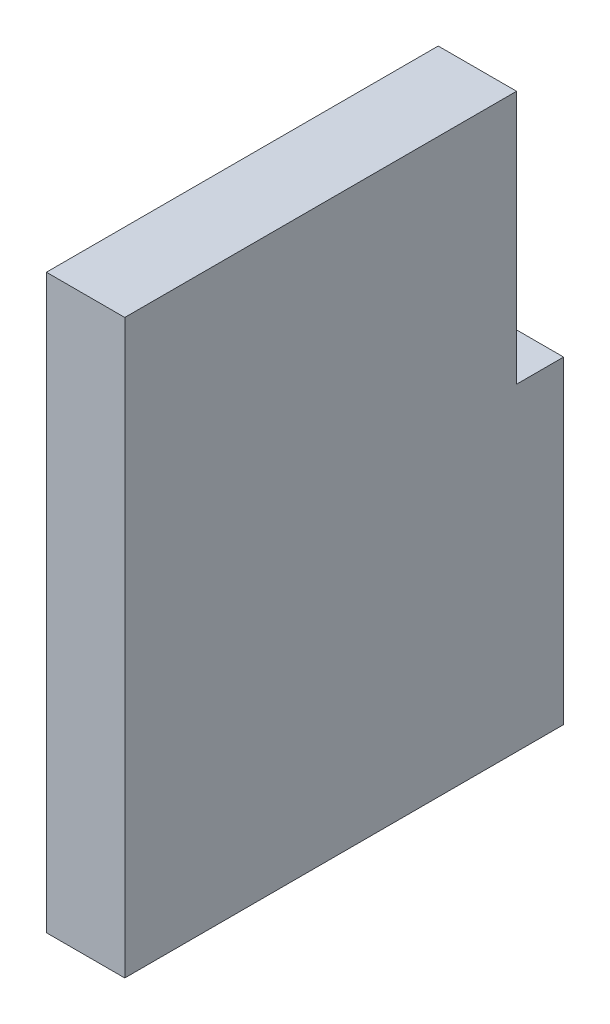
ISO-10303-21;
HEADER;
FILE_DESCRIPTION(('STEP AP214'),'2;1');
FILE_NAME('part.step','',(''),(''),'','','');
FILE_SCHEMA(('AUTOMOTIVE_DESIGN { 1 0 10303 214 1 1 1 1 }'));
ENDSEC;
DATA;
#1=APPLICATION_CONTEXT('core data for automotive mechanical design processes');
#2=APPLICATION_PROTOCOL_DEFINITION('international standard','automotive_design',2000,#1);
#3=PRODUCT_CONTEXT('',#1,'mechanical');
#4=PRODUCT('Part','Part','',(#3));
#5=PRODUCT_RELATED_PRODUCT_CATEGORY('part','',(#4));
#6=PRODUCT_DEFINITION_FORMATION('','',#4);
#7=PRODUCT_DEFINITION_CONTEXT('part definition',#1,'design');
#8=PRODUCT_DEFINITION('design','',#6,#7);
#9=PRODUCT_DEFINITION_SHAPE('','',#8);
#10=(LENGTH_UNIT() NAMED_UNIT(*) SI_UNIT(.MILLI.,.METRE.));
#11=(NAMED_UNIT(*) PLANE_ANGLE_UNIT() SI_UNIT($,.RADIAN.));
#12=(NAMED_UNIT(*) SI_UNIT($,.STERADIAN.) SOLID_ANGLE_UNIT());
#13=UNCERTAINTY_MEASURE_WITH_UNIT(LENGTH_MEASURE(1.E-05),#10,'distance_accuracy_value','');
#14=(GEOMETRIC_REPRESENTATION_CONTEXT(3) GLOBAL_UNCERTAINTY_ASSIGNED_CONTEXT((#13)) GLOBAL_UNIT_ASSIGNED_CONTEXT((#10,
#11,#12)) REPRESENTATION_CONTEXT('',''));
#15=CARTESIAN_POINT('',(0.,0.,0.));
#16=DIRECTION('',(0.,0.,1.));
#17=DIRECTION('',(1.,0.,0.));
#18=AXIS2_PLACEMENT_3D('',#15,#16,#17);
#19=CARTESIAN_POINT('',(0.,146.,0.));
#20=DIRECTION('',(0.,0.,1.));
#21=DIRECTION('',(1.,0.,0.));
#22=AXIS2_PLACEMENT_3D('',#19,#20,#21);
#23=PLANE('',#22);
#24=DIRECTION('',(1.,0.,0.));
#25=VECTOR('',#24,1.);
#26=CARTESIAN_POINT('',(0.,81.25,0.));
#27=LINE('',#26,#25);
#28=CARTESIAN_POINT('',(0.,81.25,0.));
#29=VERTEX_POINT('',#28);
#30=CARTESIAN_POINT('',(20.,81.25,0.));
#31=VERTEX_POINT('',#30);
#32=EDGE_CURVE('E61',#29,#31,#27,.T.);
#33=ORIENTED_EDGE('',*,*,#32,.F.);
#34=DIRECTION('',(0.,-1.,0.));
#35=VECTOR('',#34,1.);
#36=CARTESIAN_POINT('',(0.,146.,0.));
#37=LINE('',#36,#35);
#38=CARTESIAN_POINT('',(0.,146.,0.));
#39=VERTEX_POINT('',#38);
#40=EDGE_CURVE('E129',#39,#29,#37,.T.);
#41=ORIENTED_EDGE('',*,*,#40,.F.);
#42=DIRECTION('',(-1.,0.,0.));
#43=VECTOR('',#42,1.);
#44=CARTESIAN_POINT('',(0.,146.,0.));
#45=LINE('',#44,#43);
#46=CARTESIAN_POINT('',(20.,146.,0.));
#47=VERTEX_POINT('',#46);
#48=EDGE_CURVE('E70',#47,#39,#45,.T.);
#49=ORIENTED_EDGE('',*,*,#48,.F.);
#50=DIRECTION('',(0.,-1.,0.));
#51=VECTOR('',#50,1.);
#52=CARTESIAN_POINT('',(20.,146.,0.));
#53=LINE('',#52,#51);
#54=EDGE_CURVE('E156',#47,#31,#53,.T.);
#55=ORIENTED_EDGE('',*,*,#54,.T.);
#56=EDGE_LOOP('',(#33,#41,#49,#55));
#57=FACE_BOUND('',#56,.T.);
#58=ADVANCED_FACE('F45',(#57),#23,.F.);
#59=CARTESIAN_POINT('',(0.,146.,0.));
#60=DIRECTION('',(1.,0.,0.));
#61=DIRECTION('',(0.,0.,-1.));
#62=AXIS2_PLACEMENT_3D('',#59,#60,#61);
#63=PLANE('',#62);
#64=DIRECTION('',(0.,0.,1.));
#65=VECTOR('',#64,1.);
#66=CARTESIAN_POINT('',(0.,0.,0.));
#67=LINE('',#66,#65);
#68=CARTESIAN_POINT('',(0.,0.,-12.));
#69=VERTEX_POINT('',#68);
#70=CARTESIAN_POINT('',(0.,0.,100.));
#71=VERTEX_POINT('',#70);
#72=EDGE_CURVE('E131',#69,#71,#67,.T.);
#73=ORIENTED_EDGE('',*,*,#72,.T.);
#74=DIRECTION('',(0.,-1.,0.));
#75=VECTOR('',#74,1.);
#76=CARTESIAN_POINT('',(0.,146.,100.));
#77=LINE('',#76,#75);
#78=CARTESIAN_POINT('',(0.,146.,100.));
#79=VERTEX_POINT('',#78);
#80=EDGE_CURVE('E11',#79,#71,#77,.T.);
#81=ORIENTED_EDGE('',*,*,#80,.F.);
#82=DIRECTION('',(0.,0.,1.));
#83=VECTOR('',#82,1.);
#84=CARTESIAN_POINT('',(0.,146.,0.));
#85=LINE('',#84,#83);
#86=EDGE_CURVE('E139',#39,#79,#85,.T.);
#87=ORIENTED_EDGE('',*,*,#86,.F.);
#88=ORIENTED_EDGE('',*,*,#40,.T.);
#89=DIRECTION('',(0.,0.,1.));
#90=VECTOR('',#89,1.);
#91=CARTESIAN_POINT('',(0.,81.25,-12.));
#92=LINE('',#91,#90);
#93=CARTESIAN_POINT('',(0.,81.25,-12.));
#94=VERTEX_POINT('',#93);
#95=EDGE_CURVE('E109',#94,#29,#92,.T.);
#96=ORIENTED_EDGE('',*,*,#95,.F.);
#97=DIRECTION('',(0.,1.,0.));
#98=VECTOR('',#97,1.);
#99=CARTESIAN_POINT('',(0.,0.,-12.));
#100=LINE('',#99,#98);
#101=EDGE_CURVE('E117',#69,#94,#100,.T.);
#102=ORIENTED_EDGE('',*,*,#101,.F.);
#103=EDGE_LOOP('',(#73,#81,#87,#88,#96,#102));
#104=FACE_BOUND('',#103,.T.);
#105=ADVANCED_FACE('F47',(#104),#63,.F.);
#106=CARTESIAN_POINT('',(0.,146.,100.));
#107=DIRECTION('',(0.,0.,-1.));
#108=DIRECTION('',(-1.,0.,0.));
#109=AXIS2_PLACEMENT_3D('',#106,#107,#108);
#110=PLANE('',#109);
#111=DIRECTION('',(1.,0.,0.));
#112=VECTOR('',#111,1.);
#113=CARTESIAN_POINT('',(0.,0.,100.));
#114=LINE('',#113,#112);
#115=CARTESIAN_POINT('',(20.,0.,100.));
#116=VERTEX_POINT('',#115);
#117=EDGE_CURVE('E83',#71,#116,#114,.T.);
#118=ORIENTED_EDGE('',*,*,#117,.T.);
#119=DIRECTION('',(0.,-1.,0.));
#120=VECTOR('',#119,1.);
#121=CARTESIAN_POINT('',(20.,146.,100.));
#122=LINE('',#121,#120);
#123=CARTESIAN_POINT('',(20.,146.,100.));
#124=VERTEX_POINT('',#123);
#125=EDGE_CURVE('E54',#124,#116,#122,.T.);
#126=ORIENTED_EDGE('',*,*,#125,.F.);
#127=DIRECTION('',(1.,0.,0.));
#128=VECTOR('',#127,1.);
#129=CARTESIAN_POINT('',(0.,146.,100.));
#130=LINE('',#129,#128);
#131=EDGE_CURVE('E88',#79,#124,#130,.T.);
#132=ORIENTED_EDGE('',*,*,#131,.F.);
#133=ORIENTED_EDGE('',*,*,#80,.T.);
#134=EDGE_LOOP('',(#118,#126,#132,#133));
#135=FACE_BOUND('',#134,.T.);
#136=ADVANCED_FACE('F182',(#135),#110,.F.);
#137=CARTESIAN_POINT('',(20.,146.,0.));
#138=DIRECTION('',(-1.,0.,0.));
#139=DIRECTION('',(0.,0.,1.));
#140=AXIS2_PLACEMENT_3D('',#137,#138,#139);
#141=PLANE('',#140);
#142=DIRECTION('',(0.,0.,-1.));
#143=VECTOR('',#142,1.);
#144=CARTESIAN_POINT('',(20.,0.,0.));
#145=LINE('',#144,#143);
#146=CARTESIAN_POINT('',(20.,0.,-12.));
#147=VERTEX_POINT('',#146);
#148=EDGE_CURVE('E142',#116,#147,#145,.T.);
#149=ORIENTED_EDGE('',*,*,#148,.T.);
#150=DIRECTION('',(0.,-1.,0.));
#151=VECTOR('',#150,1.);
#152=CARTESIAN_POINT('',(20.,0.,-12.));
#153=LINE('',#152,#151);
#154=CARTESIAN_POINT('',(20.,81.25,-12.));
#155=VERTEX_POINT('',#154);
#156=EDGE_CURVE('E116',#155,#147,#153,.T.);
#157=ORIENTED_EDGE('',*,*,#156,.F.);
#158=DIRECTION('',(0.,0.,1.));
#159=VECTOR('',#158,1.);
#160=CARTESIAN_POINT('',(20.,81.25,-12.));
#161=LINE('',#160,#159);
#162=EDGE_CURVE('E111',#155,#31,#161,.T.);
#163=ORIENTED_EDGE('',*,*,#162,.T.);
#164=ORIENTED_EDGE('',*,*,#54,.F.);
#165=DIRECTION('',(0.,0.,-1.));
#166=VECTOR('',#165,1.);
#167=CARTESIAN_POINT('',(20.,146.,0.));
#168=LINE('',#167,#166);
#169=EDGE_CURVE('E145',#124,#47,#168,.T.);
#170=ORIENTED_EDGE('',*,*,#169,.F.);
#171=ORIENTED_EDGE('',*,*,#125,.T.);
#172=EDGE_LOOP('',(#149,#157,#163,#164,#170,#171));
#173=FACE_BOUND('',#172,.T.);
#174=ADVANCED_FACE('F162',(#173),#141,.F.);
#175=CARTESIAN_POINT('',(0.,146.,0.));
#176=DIRECTION('',(0.,1.,0.));
#177=DIRECTION('',(0.,0.,1.));
#178=AXIS2_PLACEMENT_3D('',#175,#176,#177);
#179=PLANE('',#178);
#180=ORIENTED_EDGE('',*,*,#86,.T.);
#181=ORIENTED_EDGE('',*,*,#131,.T.);
#182=ORIENTED_EDGE('',*,*,#169,.T.);
#183=ORIENTED_EDGE('',*,*,#48,.T.);
#184=EDGE_LOOP('',(#180,#181,#182,#183));
#185=FACE_BOUND('',#184,.T.);
#186=ADVANCED_FACE('F172',(#185),#179,.T.);
#187=CARTESIAN_POINT('',(0.,0.,0.));
#188=DIRECTION('',(0.,1.,0.));
#189=DIRECTION('',(0.,0.,1.));
#190=AXIS2_PLACEMENT_3D('',#187,#188,#189);
#191=PLANE('',#190);
#192=ORIENTED_EDGE('',*,*,#72,.F.);
#193=DIRECTION('',(-1.,0.,0.));
#194=VECTOR('',#193,1.);
#195=CARTESIAN_POINT('',(0.,0.,-12.));
#196=LINE('',#195,#194);
#197=EDGE_CURVE('E123',#147,#69,#196,.T.);
#198=ORIENTED_EDGE('',*,*,#197,.F.);
#199=ORIENTED_EDGE('',*,*,#148,.F.);
#200=ORIENTED_EDGE('',*,*,#117,.F.);
#201=EDGE_LOOP('',(#192,#198,#199,#200));
#202=FACE_BOUND('',#201,.T.);
#203=ADVANCED_FACE('F165',(#202),#191,.F.);
#204=CARTESIAN_POINT('',(0.,81.25,-12.));
#205=DIRECTION('',(0.,-1.,0.));
#206=DIRECTION('',(0.,0.,-1.));
#207=AXIS2_PLACEMENT_3D('',#204,#205,#206);
#208=PLANE('',#207);
#209=ORIENTED_EDGE('',*,*,#32,.T.);
#210=ORIENTED_EDGE('',*,*,#162,.F.);
#211=DIRECTION('',(1.,0.,0.));
#212=VECTOR('',#211,1.);
#213=CARTESIAN_POINT('',(0.,81.25,-12.));
#214=LINE('',#213,#212);
#215=EDGE_CURVE('E105',#94,#155,#214,.T.);
#216=ORIENTED_EDGE('',*,*,#215,.F.);
#217=ORIENTED_EDGE('',*,*,#95,.T.);
#218=EDGE_LOOP('',(#209,#210,#216,#217));
#219=FACE_BOUND('',#218,.T.);
#220=ADVANCED_FACE('F107',(#219),#208,.F.);
#221=CARTESIAN_POINT('',(0.,0.,-12.));
#222=DIRECTION('',(0.,0.,-1.));
#223=DIRECTION('',(-1.,0.,0.));
#224=AXIS2_PLACEMENT_3D('',#221,#222,#223);
#225=PLANE('',#224);
#226=ORIENTED_EDGE('',*,*,#101,.T.);
#227=ORIENTED_EDGE('',*,*,#215,.T.);
#228=ORIENTED_EDGE('',*,*,#156,.T.);
#229=ORIENTED_EDGE('',*,*,#197,.T.);
#230=EDGE_LOOP('',(#226,#227,#228,#229));
#231=FACE_BOUND('',#230,.T.);
#232=ADVANCED_FACE('F121',(#231),#225,.T.);
#233=CLOSED_SHELL('',(#58,#105,#136,#174,#186,#203,#220,#232));
#234=MANIFOLD_SOLID_BREP('B2',#233);
#235=ADVANCED_BREP_SHAPE_REPRESENTATION('',(#18,#234),#14);
#236=SHAPE_DEFINITION_REPRESENTATION(#9,#235);
ENDSEC;
END-ISO-10303-21;
